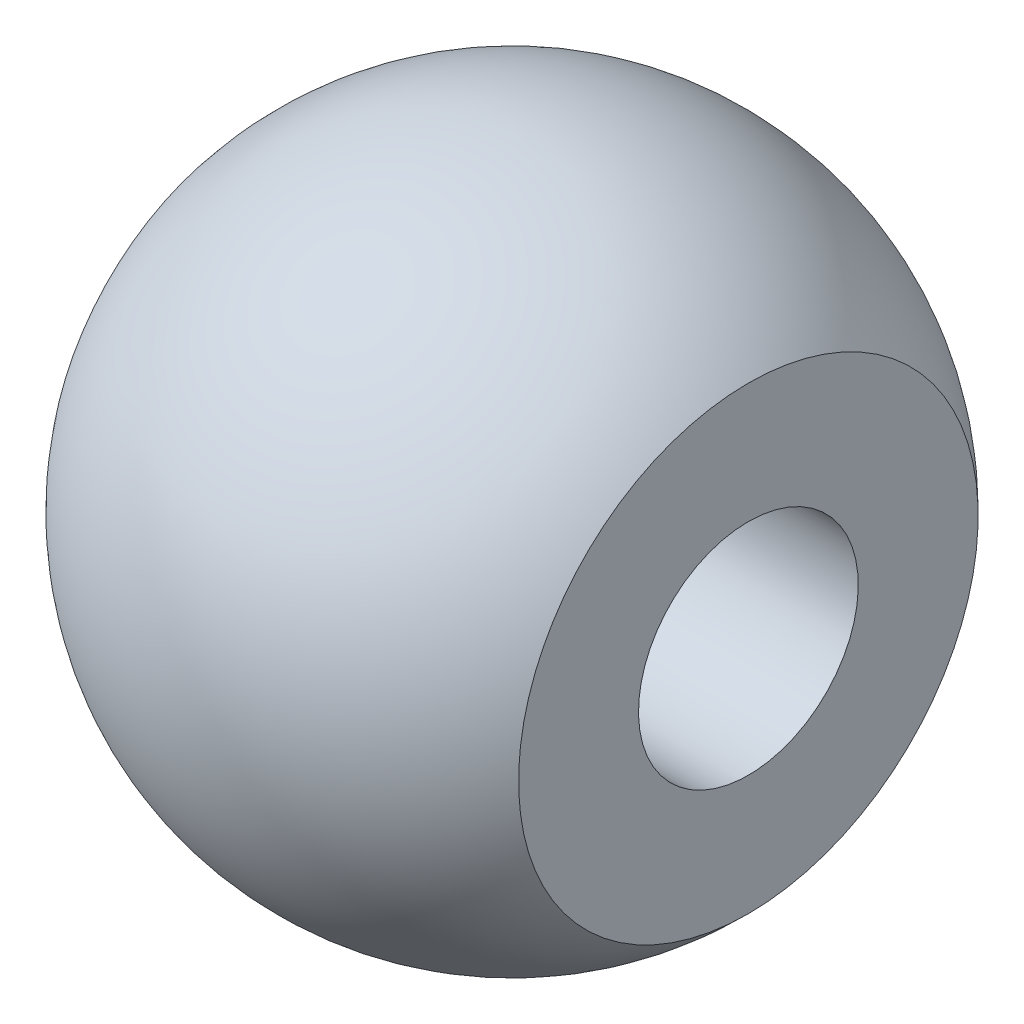
ISO-10303-21;
HEADER;
FILE_DESCRIPTION(('STEP AP214'),'2;1');
FILE_NAME('part.step','',(''),(''),'','','');
FILE_SCHEMA(('AUTOMOTIVE_DESIGN { 1 0 10303 214 1 1 1 1 }'));
ENDSEC;
DATA;
#1=APPLICATION_CONTEXT('core data for automotive mechanical design processes');
#2=APPLICATION_PROTOCOL_DEFINITION('international standard','automotive_design',2000,#1);
#3=PRODUCT_CONTEXT('',#1,'mechanical');
#4=PRODUCT('Part','Part','',(#3));
#5=PRODUCT_RELATED_PRODUCT_CATEGORY('part','',(#4));
#6=PRODUCT_DEFINITION_FORMATION('','',#4);
#7=PRODUCT_DEFINITION_CONTEXT('part definition',#1,'design');
#8=PRODUCT_DEFINITION('design','',#6,#7);
#9=PRODUCT_DEFINITION_SHAPE('','',#8);
#10=(LENGTH_UNIT() NAMED_UNIT(*) SI_UNIT(.MILLI.,.METRE.));
#11=(NAMED_UNIT(*) PLANE_ANGLE_UNIT() SI_UNIT($,.RADIAN.));
#12=(NAMED_UNIT(*) SI_UNIT($,.STERADIAN.) SOLID_ANGLE_UNIT());
#13=UNCERTAINTY_MEASURE_WITH_UNIT(LENGTH_MEASURE(1.E-05),#10,'distance_accuracy_value','');
#14=(GEOMETRIC_REPRESENTATION_CONTEXT(3) GLOBAL_UNCERTAINTY_ASSIGNED_CONTEXT((#13)) GLOBAL_UNIT_ASSIGNED_CONTEXT((#10,
#11,#12)) REPRESENTATION_CONTEXT('',''));
#15=CARTESIAN_POINT('',(0.,0.,0.));
#16=DIRECTION('',(0.,0.,1.));
#17=DIRECTION('',(1.,0.,0.));
#18=AXIS2_PLACEMENT_3D('',#15,#16,#17);
#19=CARTESIAN_POINT('',(-3.69806308703115,0.,0.));
#20=DIRECTION('',(-1.,0.,0.));
#21=DIRECTION('',(0.,-1.,0.));
#22=AXIS2_PLACEMENT_3D('',#19,#20,#21);
#23=CONICAL_SURFACE('',#22,2.,1.04719755119659);
#24=CARTESIAN_POINT('',(-4.69806308703115,0.,0.));
#25=DIRECTION('',(1.,0.,0.));
#26=DIRECTION('',(0.,1.,0.));
#27=AXIS2_PLACEMENT_3D('',#24,#25,#26);
#28=CIRCLE('',#27,3.73205080756886);
#29=CARTESIAN_POINT('',(-4.69806308703115,-3.73205080756886,0.));
#30=VERTEX_POINT('',#29);
#31=EDGE_CURVE('E10',#30,#30,#28,.T.);
#32=ORIENTED_EDGE('',*,*,#31,.F.);
#33=EDGE_LOOP('',(#32));
#34=FACE_BOUND('',#33,.T.);
#35=CARTESIAN_POINT('',(-3.69806308703115,0.,0.));
#36=DIRECTION('',(1.,0.,0.));
#37=DIRECTION('',(0.,1.,0.));
#38=AXIS2_PLACEMENT_3D('',#35,#36,#37);
#39=CIRCLE('',#38,2.);
#40=CARTESIAN_POINT('',(-3.69806308703115,2.,0.));
#41=VERTEX_POINT('',#40);
#42=EDGE_CURVE('E51',#41,#41,#39,.T.);
#43=ORIENTED_EDGE('',*,*,#42,.T.);
#44=EDGE_LOOP('',(#43));
#45=FACE_BOUND('',#44,.T.);
#46=ADVANCED_FACE('F37',(#34,#45),#23,.F.);
#47=CARTESIAN_POINT('',(0.,0.,0.));
#48=DIRECTION('',(1.,0.,0.));
#49=DIRECTION('',(0.,-1.,0.));
#50=AXIS2_PLACEMENT_3D('',#47,#48,#49);
#51=SPHERICAL_SURFACE('',#50,6.);
#52=CARTESIAN_POINT('',(4.30193691296885,0.,0.));
#53=DIRECTION('',(1.,0.,0.));
#54=DIRECTION('',(0.,1.,0.));
#55=AXIS2_PLACEMENT_3D('',#52,#53,#54);
#56=CIRCLE('',#55,4.18250389083334);
#57=CARTESIAN_POINT('',(4.30193691296885,-4.18250389083334,0.));
#58=VERTEX_POINT('',#57);
#59=EDGE_CURVE('E43',#58,#58,#56,.T.);
#60=CARTESIAN_POINT('',(4.30193691296885,-4.18250389083334,0.));
#61=CARTESIAN_POINT('',(4.22791876825173,-4.25863974007728,0.));
#62=CARTESIAN_POINT('',(4.15187572108964,-4.33280653765818,0.));
#63=CARTESIAN_POINT('',(3.99596262994844,-4.47700221198861,0.));
#64=CARTESIAN_POINT('',(3.91609258596933,-4.54703108873815,0.));
#65=CARTESIAN_POINT('',(3.75274830926703,-4.68275110390055,0.));
#66=CARTESIAN_POINT('',(3.66927407654384,-4.74844224231342,0.));
#67=CARTESIAN_POINT('',(3.49895727750192,-4.87530231242593,0.));
#68=CARTESIAN_POINT('',(3.41211471118319,-4.93647124412556,0.));
#69=CARTESIAN_POINT('',(3.23530581829326,-5.05411433952743,0.));
#70=CARTESIAN_POINT('',(3.14533949172207,-5.11058850322967,0.));
#71=CARTESIAN_POINT('',(2.96253666243581,-5.21868295633947,0.));
#72=CARTESIAN_POINT('',(2.86970015972075,-5.27030324574703,0.));
#73=CARTESIAN_POINT('',(2.68141859530028,-5.36854446289387,0.));
#74=CARTESIAN_POINT('',(2.58597353359487,-5.41516539063316,0.));
#75=CARTESIAN_POINT('',(2.39274383460246,-5.50327650221998,0.));
#76=CARTESIAN_POINT('',(2.29495919731547,-5.54476668606752,0.));
#77=CARTESIAN_POINT('',(2.09732591989518,-5.6224993826321,0.));
#78=CARTESIAN_POINT('',(1.99747727976189,-5.65874189534914,0.));
#79=CARTESIAN_POINT('',(1.79599738716152,-5.72587711239154,0.));
#80=CARTESIAN_POINT('',(1.69436613469444,-5.7567698167169,0.));
#81=CARTESIAN_POINT('',(1.48960743135424,-5.81311835606607,0.));
#82=CARTESIAN_POINT('',(1.38647998048111,-5.83857419108989,0.));
#83=CARTESIAN_POINT('',(1.17901951087248,-5.88397725302263,0.));
#84=CARTESIAN_POINT('',(1.07468649213697,-5.90392447993155,0.));
#85=CARTESIAN_POINT('',(0.865108914819969,-5.93825411098443,0.));
#86=CARTESIAN_POINT('',(0.759864356238472,-5.9526365151284,0.));
#87=CARTESIAN_POINT('',(0.54876029612422,-5.97579596861517,0.));
#88=CARTESIAN_POINT('',(0.442900794591464,-5.98457301795797,0.));
#89=CARTESIAN_POINT('',(0.230865178480766,-5.99649702663863,0.));
#90=CARTESIAN_POINT('',(0.124689063902824,-5.99964398597648,0.));
#91=CARTESIAN_POINT('',(-0.0876805561228888,-6.00029894598582,0.));
#92=CARTESIAN_POINT('',(-0.19387406157066,-5.99780694665731,0.));
#93=CARTESIAN_POINT('',(-0.405979192150369,-5.98719101220777,0.));
#94=CARTESIAN_POINT('',(-0.511890817282307,-5.97906707708674,0.));
#95=CARTESIAN_POINT('',(-0.723133710430905,-5.95721016566976,0.));
#96=CARTESIAN_POINT('',(-0.828464978447563,-5.94347718937381,0.));
#97=CARTESIAN_POINT('',(-1.03825031611015,-5.91044089744729,0.));
#98=CARTESIAN_POINT('',(-1.14270438575608,-5.89113758181673,0.));
#99=CARTESIAN_POINT('',(-1.35044095751495,-5.84701501121621,0.));
#100=CARTESIAN_POINT('',(-1.4537234596279,-5.82219575624626,0.));
#101=CARTESIAN_POINT('',(-1.65882582883158,-5.76711125180691,0.));
#102=CARTESIAN_POINT('',(-1.76064569592232,-5.73684600233751,0.));
#103=CARTESIAN_POINT('',(-1.96253584955028,-5.67095480147443,0.));
#104=CARTESIAN_POINT('',(-2.06260613608751,-5.63532885008074,0.));
#105=CARTESIAN_POINT('',(-2.26071511366718,-5.55881664528512,0.));
#106=CARTESIAN_POINT('',(-2.35875380470962,-5.51793039188319,0.));
#107=CARTESIAN_POINT('',(-2.55252330182142,-5.43101280747921,0.));
#108=CARTESIAN_POINT('',(-2.64825410789079,-5.38498147647715,0.));
#109=CARTESIAN_POINT('',(-2.83713804927069,-5.28790346069664,0.));
#110=CARTESIAN_POINT('',(-2.93029118458122,-5.23685677591819,0.));
#111=CARTESIAN_POINT('',(-3.11375726414769,-5.12989191156419,0.));
#112=CARTESIAN_POINT('',(-3.20407020840364,-5.07397373198865,0.));
#113=CARTESIAN_POINT('',(-3.38160138529949,-4.95742346181699,0.));
#114=CARTESIAN_POINT('',(-3.46881961793939,-4.89679137122087,0.));
#115=CARTESIAN_POINT('',(-3.63991558889075,-4.77098416191878,0.));
#116=CARTESIAN_POINT('',(-3.7237933272022,-4.70580904321281,0.));
#117=CARTESIAN_POINT('',(-3.88797187954069,-4.57109940936009,0.));
#118=CARTESIAN_POINT('',(-3.96827269356772,-4.50156489421335,0.));
#119=CARTESIAN_POINT('',(-4.12507127660307,-4.35833258716307,0.));
#120=CARTESIAN_POINT('',(-4.20156904561137,-4.28463479525954,0.));
#121=CARTESIAN_POINT('',(-4.35054528142961,-4.13328303144918,0.));
#122=CARTESIAN_POINT('',(-4.42302374823955,-4.05562905954234,0.));
#123=CARTESIAN_POINT('',(-4.56375963697259,-3.89658600214173,0.));
#124=CARTESIAN_POINT('',(-4.63201705889569,-3.81519691664795,0.));
#125=CARTESIAN_POINT('',(-4.69806308703115,-3.73205080756886,0.));
#126=B_SPLINE_CURVE_WITH_KNOTS('',3,(#60,#61,#62,#63,#64,#65,#66,#67,#68,#69,#70,#71,#72,#73,
#74,#75,#76,#77,#78,#79,#80,#81,#82,#83,#84,#85,#86,#87,#88,#89,#90,#91,#92,#93,#94,#95,#96,#97,
#98,#99,#100,#101,#102,#103,#104,#105,#106,#107,#108,#109,#110,#111,#112,#113,#114,#115,#116,
#117,#118,#119,#120,#121,#122,#123,#124,#125),.UNSPECIFIED.,.F.,.F.,(4,2,2,2,2,2,2,2,2,2,2,2,2,
2,2,2,2,2,2,2,2,2,2,2,2,2,2,2,2,2,2,2,4),(0.,0.318518545567989,0.637037091135977,
0.955555636703965,1.27407418227195,1.59259272783994,1.91111127340793,2.22962981897592,
2.54814836454391,2.8666669101119,3.18518545567988,3.50370400124787,3.82222254681586,
4.14074109238385,4.45925963795184,4.77777818351983,5.09629672908781,5.4148152746558,
5.73333382022379,6.05185236579178,6.37037091135977,6.68888945692776,7.00740800249575,
7.32592654806373,7.64444509363172,7.96296363919971,8.2814821847677,8.60000073033569,
8.91851927590367,9.23703782147166,9.55555636703965,9.87407491260764,10.1925934581756),.UNSPECIFIED.);
#127=EDGE_CURVE('BSEAM66',#58,#30,#126,.T.);
#128=ORIENTED_EDGE('',*,*,#59,.F.);
#129=ORIENTED_EDGE('',*,*,#31,.T.);
#130=ORIENTED_EDGE('',*,*,#127,.T.);
#131=ORIENTED_EDGE('',*,*,#127,.F.);
#132=EDGE_LOOP('',(#128,#130,#129,#131));
#133=FACE_BOUND('',#132,.T.);
#134=ADVANCED_FACE('F66',(#133),#51,.T.);
#135=CARTESIAN_POINT('',(4.30193691296885,0.,0.));
#136=DIRECTION('',(1.,0.,0.));
#137=DIRECTION('',(0.,1.,0.));
#138=AXIS2_PLACEMENT_3D('',#135,#136,#137);
#139=PLANE('',#138);
#140=ORIENTED_EDGE('',*,*,#59,.T.);
#141=EDGE_LOOP('',(#140));
#142=FACE_BOUND('',#141,.T.);
#143=CARTESIAN_POINT('',(4.30193691296885,0.,0.));
#144=DIRECTION('',(1.,0.,0.));
#145=DIRECTION('',(0.,1.,0.));
#146=AXIS2_PLACEMENT_3D('',#143,#144,#145);
#147=CIRCLE('',#146,2.);
#148=CARTESIAN_POINT('',(4.30193691296885,2.,0.));
#149=VERTEX_POINT('',#148);
#150=EDGE_CURVE('E47',#149,#149,#147,.T.);
#151=ORIENTED_EDGE('',*,*,#150,.F.);
#152=EDGE_LOOP('',(#151));
#153=FACE_BOUND('',#152,.T.);
#154=ADVANCED_FACE('F60',(#142,#153),#139,.T.);
#155=CARTESIAN_POINT('',(4.30193691296885,0.,0.));
#156=DIRECTION('',(1.,0.,0.));
#157=DIRECTION('',(0.,1.,0.));
#158=AXIS2_PLACEMENT_3D('',#155,#156,#157);
#159=CYLINDRICAL_SURFACE('',#158,2.);
#160=ORIENTED_EDGE('',*,*,#150,.T.);
#161=EDGE_LOOP('',(#160));
#162=FACE_BOUND('',#161,.T.);
#163=ORIENTED_EDGE('',*,*,#42,.F.);
#164=EDGE_LOOP('',(#163));
#165=FACE_BOUND('',#164,.T.);
#166=ADVANCED_FACE('F58',(#162,#165),#159,.F.);
#167=CLOSED_SHELL('',(#46,#134,#154,#166));
#168=MANIFOLD_SOLID_BREP('B2',#167);
#169=ADVANCED_BREP_SHAPE_REPRESENTATION('',(#18,#168),#14);
#170=SHAPE_DEFINITION_REPRESENTATION(#9,#169);
ENDSEC;
END-ISO-10303-21;
